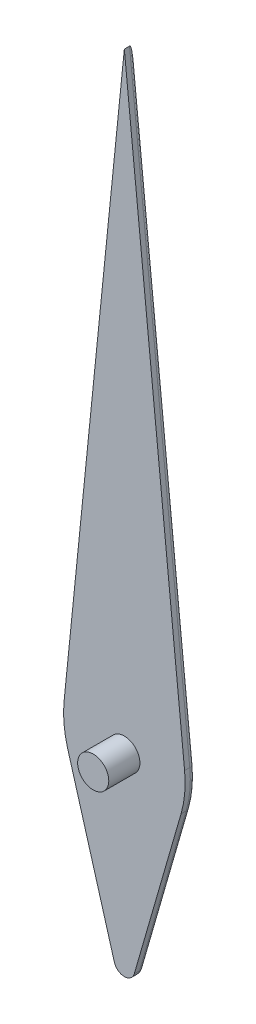
ISO-10303-21;
HEADER;
FILE_DESCRIPTION(('STEP AP214'),'2;1');
FILE_NAME('part.step','',(''),(''),'','','');
FILE_SCHEMA(('AUTOMOTIVE_DESIGN { 1 0 10303 214 1 1 1 1 }'));
ENDSEC;
DATA;
#1=APPLICATION_CONTEXT('core data for automotive mechanical design processes');
#2=APPLICATION_PROTOCOL_DEFINITION('international standard','automotive_design',2000,#1);
#3=PRODUCT_CONTEXT('',#1,'mechanical');
#4=PRODUCT('Part','Part','',(#3));
#5=PRODUCT_RELATED_PRODUCT_CATEGORY('part','',(#4));
#6=PRODUCT_DEFINITION_FORMATION('','',#4);
#7=PRODUCT_DEFINITION_CONTEXT('part definition',#1,'design');
#8=PRODUCT_DEFINITION('design','',#6,#7);
#9=PRODUCT_DEFINITION_SHAPE('','',#8);
#10=(LENGTH_UNIT() NAMED_UNIT(*) SI_UNIT(.MILLI.,.METRE.));
#11=(NAMED_UNIT(*) PLANE_ANGLE_UNIT() SI_UNIT($,.RADIAN.));
#12=(NAMED_UNIT(*) SI_UNIT($,.STERADIAN.) SOLID_ANGLE_UNIT());
#13=UNCERTAINTY_MEASURE_WITH_UNIT(LENGTH_MEASURE(1.E-05),#10,'distance_accuracy_value','');
#14=(GEOMETRIC_REPRESENTATION_CONTEXT(3) GLOBAL_UNCERTAINTY_ASSIGNED_CONTEXT((#13)) GLOBAL_UNIT_ASSIGNED_CONTEXT((#10,
#11,#12)) REPRESENTATION_CONTEXT('',''));
#15=CARTESIAN_POINT('',(0.,0.,0.));
#16=DIRECTION('',(0.,0.,1.));
#17=DIRECTION('',(1.,0.,0.));
#18=AXIS2_PLACEMENT_3D('',#15,#16,#17);
#19=CARTESIAN_POINT('',(0.414403604912211,2.16897108510449,0.1));
#20=DIRECTION('',(0.,0.,1.));
#21=DIRECTION('',(1.,0.,0.));
#22=AXIS2_PLACEMENT_3D('',#19,#20,#21);
#23=PLANE('',#22);
#24=DIRECTION('',(0.277491390365258,-0.960728124014883,0.));
#25=VECTOR('',#24,1.);
#26=CARTESIAN_POINT('',(-0.546324519102673,1.89147969473923,0.1));
#27=LINE('',#26,#25);
#28=CARTESIAN_POINT('',(-0.546324519102673,1.89147969473923,0.1));
#29=VERTEX_POINT('',#28);
#30=CARTESIAN_POINT('',(-0.0960728124014884,0.332622402107044,0.1));
#31=VERTEX_POINT('',#30);
#32=EDGE_CURVE('E211',#29,#31,#27,.T.);
#33=ORIENTED_EDGE('',*,*,#32,.T.);
#34=CARTESIAN_POINT('',(0.,0.360371541143569,0.1));
#35=DIRECTION('',(0.,0.,1.));
#36=DIRECTION('',(1.,0.,0.));
#37=AXIS2_PLACEMENT_3D('',#34,#35,#36);
#38=CIRCLE('',#37,0.1);
#39=CARTESIAN_POINT('',(0.0960728124014884,0.332622402107044,0.1));
#40=VERTEX_POINT('',#39);
#41=EDGE_CURVE('E121',#31,#40,#38,.T.);
#42=ORIENTED_EDGE('',*,*,#41,.T.);
#43=DIRECTION('',(0.277491390365258,0.960728124014883,0.));
#44=VECTOR('',#43,1.);
#45=CARTESIAN_POINT('',(0.546324519102673,1.89147969473923,0.1));
#46=LINE('',#45,#44);
#47=CARTESIAN_POINT('',(0.546324519102672,1.89147969473923,0.1));
#48=VERTEX_POINT('',#47);
#49=EDGE_CURVE('E114',#40,#48,#46,.T.);
#50=ORIENTED_EDGE('',*,*,#49,.T.);
#51=CARTESIAN_POINT('',(-0.414403604912211,2.16897108510449,0.1));
#52=DIRECTION('',(0.,0.,1.));
#53=DIRECTION('',(1.,0.,0.));
#54=AXIS2_PLACEMENT_3D('',#51,#52,#53);
#55=CIRCLE('',#54,1.);
#56=CARTESIAN_POINT('',(0.580504165533117,2.26976060989504,0.1));
#57=VERTEX_POINT('',#56);
#58=EDGE_CURVE('E118',#48,#57,#55,.T.);
#59=ORIENTED_EDGE('',*,*,#58,.T.);
#60=DIRECTION('',(-0.100789524790552,0.994907770445329,0.));
#61=VECTOR('',#60,1.);
#62=CARTESIAN_POINT('',(0.,8.,0.1));
#63=LINE('',#62,#61);
#64=CARTESIAN_POINT('',(0.,8.,0.1));
#65=VERTEX_POINT('',#64);
#66=EDGE_CURVE('E134',#57,#65,#63,.T.);
#67=ORIENTED_EDGE('',*,*,#66,.T.);
#68=DIRECTION('',(-0.100789524790552,-0.994907770445329,0.));
#69=VECTOR('',#68,1.);
#70=CARTESIAN_POINT('',(0.,8.,0.1));
#71=LINE('',#70,#69);
#72=CARTESIAN_POINT('',(-0.580504165533118,2.26976060989504,0.1));
#73=VERTEX_POINT('',#72);
#74=EDGE_CURVE('E207',#65,#73,#71,.T.);
#75=ORIENTED_EDGE('',*,*,#74,.T.);
#76=CARTESIAN_POINT('',(0.414403604912211,2.16897108510449,0.1));
#77=DIRECTION('',(0.,0.,1.));
#78=DIRECTION('',(1.,0.,0.));
#79=AXIS2_PLACEMENT_3D('',#76,#77,#78);
#80=CIRCLE('',#79,1.);
#81=EDGE_CURVE('E209',#73,#29,#80,.T.);
#82=ORIENTED_EDGE('',*,*,#81,.T.);
#83=EDGE_LOOP('',(#33,#42,#50,#59,#67,#75,#82));
#84=FACE_BOUND('',#83,.T.);
#85=CARTESIAN_POINT('',(0.,2.11792614708809,0.1));
#86=DIRECTION('',(0.,0.,1.));
#87=DIRECTION('',(1.,0.,0.));
#88=AXIS2_PLACEMENT_3D('',#85,#86,#87);
#89=CIRCLE('',#88,0.15);
#90=CARTESIAN_POINT('',(0.15,2.11792614708809,0.1));
#91=VERTEX_POINT('',#90);
#92=EDGE_CURVE('E194',#91,#91,#89,.T.);
#93=ORIENTED_EDGE('',*,*,#92,.F.);
#94=EDGE_LOOP('',(#93));
#95=FACE_BOUND('',#94,.T.);
#96=ADVANCED_FACE('F34',(#84,#95),#23,.T.);
#97=CARTESIAN_POINT('',(0.546324519102673,1.89147969473923,0.1));
#98=DIRECTION('',(-0.960728124014883,0.277491390365258,0.));
#99=DIRECTION('',(-0.277491390365258,-0.960728124014883,0.));
#100=AXIS2_PLACEMENT_3D('',#97,#98,#99);
#101=PLANE('',#100);
#102=DIRECTION('',(0.,0.,-1.));
#103=VECTOR('',#102,1.);
#104=CARTESIAN_POINT('',(0.0960728124014882,0.332622402107043,0.1));
#105=LINE('',#104,#103);
#106=CARTESIAN_POINT('',(0.0960728124014882,0.332622402107043,0.05));
#107=VERTEX_POINT('',#106);
#108=EDGE_CURVE('E139',#40,#107,#105,.T.);
#109=ORIENTED_EDGE('',*,*,#108,.T.);
#110=DIRECTION('',(0.277491390365258,0.960728124014883,0.));
#111=VECTOR('',#110,1.);
#112=CARTESIAN_POINT('',(0.546324519102673,1.89147969473923,0.05));
#113=LINE('',#112,#111);
#114=CARTESIAN_POINT('',(0.546324519102672,1.89147969473923,0.05));
#115=VERTEX_POINT('',#114);
#116=EDGE_CURVE('E138',#107,#115,#113,.T.);
#117=ORIENTED_EDGE('',*,*,#116,.T.);
#118=DIRECTION('',(0.,0.,-1.));
#119=VECTOR('',#118,1.);
#120=CARTESIAN_POINT('',(0.546324519102672,1.89147969473923,0.1));
#121=LINE('',#120,#119);
#122=EDGE_CURVE('E129',#48,#115,#121,.T.);
#123=ORIENTED_EDGE('',*,*,#122,.F.);
#124=ORIENTED_EDGE('',*,*,#49,.F.);
#125=EDGE_LOOP('',(#109,#117,#123,#124));
#126=FACE_BOUND('',#125,.T.);
#127=ADVANCED_FACE('F136',(#126),#101,.F.);
#128=CARTESIAN_POINT('',(-0.414403604912211,2.16897108510449,0.1));
#129=DIRECTION('',(0.,0.,-1.));
#130=DIRECTION('',(-1.,0.,0.));
#131=AXIS2_PLACEMENT_3D('',#128,#129,#130);
#132=CYLINDRICAL_SURFACE('',#131,1.);
#133=ORIENTED_EDGE('',*,*,#122,.T.);
#134=CARTESIAN_POINT('',(-0.414403604912211,2.16897108510449,0.05));
#135=DIRECTION('',(0.,0.,1.));
#136=DIRECTION('',(1.,0.,0.));
#137=AXIS2_PLACEMENT_3D('',#134,#135,#136);
#138=CIRCLE('',#137,1.);
#139=CARTESIAN_POINT('',(0.580504165533117,2.26976060989504,0.05));
#140=VERTEX_POINT('',#139);
#141=EDGE_CURVE('E171',#115,#140,#138,.T.);
#142=ORIENTED_EDGE('',*,*,#141,.T.);
#143=DIRECTION('',(0.,0.,-1.));
#144=VECTOR('',#143,1.);
#145=CARTESIAN_POINT('',(0.580504165533117,2.26976060989504,0.1));
#146=LINE('',#145,#144);
#147=EDGE_CURVE('E132',#57,#140,#146,.T.);
#148=ORIENTED_EDGE('',*,*,#147,.F.);
#149=ORIENTED_EDGE('',*,*,#58,.F.);
#150=EDGE_LOOP('',(#133,#142,#148,#149));
#151=FACE_BOUND('',#150,.T.);
#152=ADVANCED_FACE('F128',(#151),#132,.T.);
#153=CARTESIAN_POINT('',(0.,8.,0.1));
#154=DIRECTION('',(-0.994907770445329,-0.100789524790552,0.));
#155=DIRECTION('',(0.100789524790552,-0.994907770445329,0.));
#156=AXIS2_PLACEMENT_3D('',#153,#154,#155);
#157=PLANE('',#156);
#158=ORIENTED_EDGE('',*,*,#147,.T.);
#159=DIRECTION('',(-0.100789524790552,0.994907770445329,0.));
#160=VECTOR('',#159,1.);
#161=CARTESIAN_POINT('',(0.,8.,0.05));
#162=LINE('',#161,#160);
#163=CARTESIAN_POINT('',(0.,8.,0.05));
#164=VERTEX_POINT('',#163);
#165=EDGE_CURVE('E169',#140,#164,#162,.T.);
#166=ORIENTED_EDGE('',*,*,#165,.T.);
#167=DIRECTION('',(0.,0.,-1.));
#168=VECTOR('',#167,1.);
#169=CARTESIAN_POINT('',(0.,8.,0.1));
#170=LINE('',#169,#168);
#171=EDGE_CURVE('E143',#65,#164,#170,.T.);
#172=ORIENTED_EDGE('',*,*,#171,.F.);
#173=ORIENTED_EDGE('',*,*,#66,.F.);
#174=EDGE_LOOP('',(#158,#166,#172,#173));
#175=FACE_BOUND('',#174,.T.);
#176=ADVANCED_FACE('F260',(#175),#157,.F.);
#177=CARTESIAN_POINT('',(0.,8.,0.1));
#178=DIRECTION('',(0.994907770445329,-0.100789524790552,0.));
#179=DIRECTION('',(0.100789524790552,0.994907770445329,0.));
#180=AXIS2_PLACEMENT_3D('',#177,#178,#179);
#181=PLANE('',#180);
#182=ORIENTED_EDGE('',*,*,#171,.T.);
#183=DIRECTION('',(-0.100789524790552,-0.994907770445329,0.));
#184=VECTOR('',#183,1.);
#185=CARTESIAN_POINT('',(0.,8.,0.05));
#186=LINE('',#185,#184);
#187=CARTESIAN_POINT('',(-0.580504165533118,2.26976060989504,0.05));
#188=VERTEX_POINT('',#187);
#189=EDGE_CURVE('E149',#164,#188,#186,.T.);
#190=ORIENTED_EDGE('',*,*,#189,.T.);
#191=DIRECTION('',(0.,0.,-1.));
#192=VECTOR('',#191,1.);
#193=CARTESIAN_POINT('',(-0.580504165533118,2.26976060989504,0.1));
#194=LINE('',#193,#192);
#195=EDGE_CURVE('E215',#73,#188,#194,.T.);
#196=ORIENTED_EDGE('',*,*,#195,.F.);
#197=ORIENTED_EDGE('',*,*,#74,.F.);
#198=EDGE_LOOP('',(#182,#190,#196,#197));
#199=FACE_BOUND('',#198,.T.);
#200=ADVANCED_FACE('F222',(#199),#181,.F.);
#201=CARTESIAN_POINT('',(0.414403604912211,2.16897108510449,0.1));
#202=DIRECTION('',(0.,0.,-1.));
#203=DIRECTION('',(-1.,0.,0.));
#204=AXIS2_PLACEMENT_3D('',#201,#202,#203);
#205=CYLINDRICAL_SURFACE('',#204,1.);
#206=ORIENTED_EDGE('',*,*,#195,.T.);
#207=CARTESIAN_POINT('',(0.414403604912211,2.16897108510449,0.05));
#208=DIRECTION('',(0.,0.,1.));
#209=DIRECTION('',(1.,0.,0.));
#210=AXIS2_PLACEMENT_3D('',#207,#208,#209);
#211=CIRCLE('',#210,1.);
#212=CARTESIAN_POINT('',(-0.546324519102673,1.89147969473923,0.05));
#213=VERTEX_POINT('',#212);
#214=EDGE_CURVE('E167',#188,#213,#211,.T.);
#215=ORIENTED_EDGE('',*,*,#214,.T.);
#216=DIRECTION('',(0.,0.,-1.));
#217=VECTOR('',#216,1.);
#218=CARTESIAN_POINT('',(-0.546324519102673,1.89147969473923,0.1));
#219=LINE('',#218,#217);
#220=EDGE_CURVE('E213',#29,#213,#219,.T.);
#221=ORIENTED_EDGE('',*,*,#220,.F.);
#222=ORIENTED_EDGE('',*,*,#81,.F.);
#223=EDGE_LOOP('',(#206,#215,#221,#222));
#224=FACE_BOUND('',#223,.T.);
#225=ADVANCED_FACE('F241',(#224),#205,.T.);
#226=CARTESIAN_POINT('',(-0.546324519102673,1.89147969473923,0.1));
#227=DIRECTION('',(0.960728124014883,0.277491390365258,0.));
#228=DIRECTION('',(-0.277491390365258,0.960728124014883,0.));
#229=AXIS2_PLACEMENT_3D('',#226,#227,#228);
#230=PLANE('',#229);
#231=ORIENTED_EDGE('',*,*,#220,.T.);
#232=DIRECTION('',(0.277491390365258,-0.960728124014883,0.));
#233=VECTOR('',#232,1.);
#234=CARTESIAN_POINT('',(-0.546324519102673,1.89147969473923,0.05));
#235=LINE('',#234,#233);
#236=CARTESIAN_POINT('',(-0.0960728124014881,0.332622402107043,0.05));
#237=VERTEX_POINT('',#236);
#238=EDGE_CURVE('E42',#213,#237,#235,.T.);
#239=ORIENTED_EDGE('',*,*,#238,.T.);
#240=DIRECTION('',(0.,0.,-1.));
#241=VECTOR('',#240,1.);
#242=CARTESIAN_POINT('',(-0.0960728124014881,0.332622402107043,0.1));
#243=LINE('',#242,#241);
#244=EDGE_CURVE('E141',#237,#31,#243,.F.);
#245=ORIENTED_EDGE('',*,*,#244,.T.);
#246=ORIENTED_EDGE('',*,*,#32,.F.);
#247=EDGE_LOOP('',(#231,#239,#245,#246));
#248=FACE_BOUND('',#247,.T.);
#249=ADVANCED_FACE('F244',(#248),#230,.F.);
#250=CARTESIAN_POINT('',(0.414403604912211,2.16897108510449,0.));
#251=DIRECTION('',(0.,0.,1.));
#252=DIRECTION('',(1.,0.,0.));
#253=AXIS2_PLACEMENT_3D('',#250,#251,#252);
#254=PLANE('',#253);
#255=CARTESIAN_POINT('',(0.,2.11792614708809,0.));
#256=DIRECTION('',(0.,0.,1.));
#257=DIRECTION('',(1.,0.,0.));
#258=AXIS2_PLACEMENT_3D('',#255,#256,#257);
#259=CIRCLE('',#258,0.2);
#260=CARTESIAN_POINT('',(0.2,2.11792614708809,0.));
#261=VERTEX_POINT('',#260);
#262=EDGE_CURVE('E11',#261,#261,#259,.T.);
#263=ORIENTED_EDGE('',*,*,#262,.T.);
#264=EDGE_LOOP('',(#263));
#265=FACE_BOUND('',#264,.T.);
#266=CARTESIAN_POINT('',(0.414403604912211,2.16897108510449,0.));
#267=DIRECTION('',(0.,0.,1.));
#268=DIRECTION('',(1.,0.,0.));
#269=AXIS2_PLACEMENT_3D('',#266,#267,#268);
#270=CIRCLE('',#269,0.95);
#271=CARTESIAN_POINT('',(-0.498288112901929,1.90535426425749,0.));
#272=VERTEX_POINT('',#271);
#273=CARTESIAN_POINT('',(-0.530758777010852,2.26472113365551,0.));
#274=VERTEX_POINT('',#273);
#275=EDGE_CURVE('E162',#272,#274,#270,.F.);
#276=ORIENTED_EDGE('',*,*,#275,.T.);
#277=DIRECTION('',(-0.100789524790552,-0.994907770445329,0.));
#278=VECTOR('',#277,1.);
#279=CARTESIAN_POINT('',(-0.530758777010851,2.26472113365551,0.));
#280=LINE('',#279,#278);
#281=CARTESIAN_POINT('',(0.,7.50391670063031,0.));
#282=VERTEX_POINT('',#281);
#283=EDGE_CURVE('E164',#274,#282,#280,.F.);
#284=ORIENTED_EDGE('',*,*,#283,.T.);
#285=DIRECTION('',(-0.100789524790552,0.994907770445329,0.));
#286=VECTOR('',#285,1.);
#287=CARTESIAN_POINT('',(0.539178238513317,2.18161142866211,0.));
#288=LINE('',#287,#286);
#289=CARTESIAN_POINT('',(0.530758777010852,2.26472113365551,0.));
#290=VERTEX_POINT('',#289);
#291=EDGE_CURVE('E160',#282,#290,#288,.F.);
#292=ORIENTED_EDGE('',*,*,#291,.T.);
#293=CARTESIAN_POINT('',(-0.414403604912211,2.16897108510449,0.));
#294=DIRECTION('',(0.,0.,1.));
#295=DIRECTION('',(1.,0.,0.));
#296=AXIS2_PLACEMENT_3D('',#293,#294,#295);
#297=CIRCLE('',#296,0.95);
#298=CARTESIAN_POINT('',(0.498288112901929,1.90535426425749,0.));
#299=VERTEX_POINT('',#298);
#300=EDGE_CURVE('E158',#290,#299,#297,.F.);
#301=ORIENTED_EDGE('',*,*,#300,.T.);
#302=DIRECTION('',(0.277491390365258,0.960728124014883,0.));
#303=VECTOR('',#302,1.);
#304=CARTESIAN_POINT('',(0.562107487836228,2.12630911361598,0.));
#305=LINE('',#304,#303);
#306=CARTESIAN_POINT('',(0.0480364062007441,0.346496971625306,0.));
#307=VERTEX_POINT('',#306);
#308=EDGE_CURVE('E156',#299,#307,#305,.F.);
#309=ORIENTED_EDGE('',*,*,#308,.T.);
#310=CARTESIAN_POINT('',(0.,0.360371541143569,0.));
#311=DIRECTION('',(0.,0.,1.));
#312=DIRECTION('',(1.,0.,0.));
#313=AXIS2_PLACEMENT_3D('',#310,#311,#312);
#314=CIRCLE('',#313,0.05);
#315=CARTESIAN_POINT('',(-0.048036406200744,0.346496971625306,0.));
#316=VERTEX_POINT('',#315);
#317=EDGE_CURVE('E154',#307,#316,#314,.F.);
#318=ORIENTED_EDGE('',*,*,#317,.T.);
#319=DIRECTION('',(0.277491390365258,-0.960728124014883,0.));
#320=VECTOR('',#319,1.);
#321=CARTESIAN_POINT('',(-0.498288112901929,1.90535426425749,0.));
#322=LINE('',#321,#320);
#323=EDGE_CURVE('E152',#316,#272,#322,.F.);
#324=ORIENTED_EDGE('',*,*,#323,.T.);
#325=EDGE_LOOP('',(#276,#284,#292,#301,#309,#318,#324));
#326=FACE_BOUND('',#325,.T.);
#327=ADVANCED_FACE('F251',(#265,#326),#254,.F.);
#328=CARTESIAN_POINT('',(0.,2.11792614708809,0.4));
#329=DIRECTION('',(0.,0.,-1.));
#330=DIRECTION('',(-1.,0.,0.));
#331=AXIS2_PLACEMENT_3D('',#328,#329,#330);
#332=CYLINDRICAL_SURFACE('',#331,0.15);
#333=CARTESIAN_POINT('',(0.,2.11792614708809,0.4));
#334=DIRECTION('',(0.,0.,1.));
#335=DIRECTION('',(1.,0.,0.));
#336=AXIS2_PLACEMENT_3D('',#333,#334,#335);
#337=CIRCLE('',#336,0.15);
#338=CARTESIAN_POINT('',(0.15,2.11792614708809,0.4));
#339=VERTEX_POINT('',#338);
#340=EDGE_CURVE('E124',#339,#339,#337,.T.);
#341=ORIENTED_EDGE('',*,*,#340,.F.);
#342=EDGE_LOOP('',(#341));
#343=FACE_BOUND('',#342,.T.);
#344=ORIENTED_EDGE('',*,*,#92,.T.);
#345=EDGE_LOOP('',(#344));
#346=FACE_BOUND('',#345,.T.);
#347=ADVANCED_FACE('F269',(#343,#346),#332,.T.);
#348=CARTESIAN_POINT('',(0.,2.11792614708809,0.4));
#349=DIRECTION('',(0.,0.,1.));
#350=DIRECTION('',(1.,0.,0.));
#351=AXIS2_PLACEMENT_3D('',#348,#349,#350);
#352=PLANE('',#351);
#353=ORIENTED_EDGE('',*,*,#340,.T.);
#354=EDGE_LOOP('',(#353));
#355=FACE_BOUND('',#354,.T.);
#356=ADVANCED_FACE('F263',(#355),#352,.T.);
#357=CARTESIAN_POINT('',(0.,0.360371541143569,0.1));
#358=DIRECTION('',(0.,0.,-1.));
#359=DIRECTION('',(-1.,0.,0.));
#360=AXIS2_PLACEMENT_3D('',#357,#358,#359);
#361=CYLINDRICAL_SURFACE('',#360,0.1);
#362=ORIENTED_EDGE('',*,*,#244,.F.);
#363=CARTESIAN_POINT('',(0.,0.360371541143569,0.05));
#364=DIRECTION('',(0.,0.,1.));
#365=DIRECTION('',(1.,0.,0.));
#366=AXIS2_PLACEMENT_3D('',#363,#364,#365);
#367=CIRCLE('',#366,0.1);
#368=EDGE_CURVE('E55',#237,#107,#367,.T.);
#369=ORIENTED_EDGE('',*,*,#368,.T.);
#370=ORIENTED_EDGE('',*,*,#108,.F.);
#371=ORIENTED_EDGE('',*,*,#41,.F.);
#372=EDGE_LOOP('',(#362,#369,#370,#371));
#373=FACE_BOUND('',#372,.T.);
#374=ADVANCED_FACE('F261',(#373),#361,.T.);
#375=CARTESIAN_POINT('',(0.498288112901929,1.90535426425749,0.05));
#376=DIRECTION('',(0.277491390365258,0.960728124014883,0.));
#377=DIRECTION('',(-0.960728124014883,0.277491390365258,0.));
#378=AXIS2_PLACEMENT_3D('',#375,#376,#377);
#379=CYLINDRICAL_SURFACE('',#378,0.05);
#380=CARTESIAN_POINT('',(0.498288112901929,1.90535426425749,0.05));
#381=DIRECTION('',(0.277491390365258,0.960728124014883,0.));
#382=DIRECTION('',(-0.960728124014883,0.277491390365259,0.));
#383=AXIS2_PLACEMENT_3D('',#380,#381,#382);
#384=CIRCLE('',#383,0.05);
#385=EDGE_CURVE('E190',#115,#299,#384,.T.);
#386=ORIENTED_EDGE('',*,*,#385,.F.);
#387=ORIENTED_EDGE('',*,*,#116,.F.);
#388=CARTESIAN_POINT('',(0.048036406200744,0.346496971625306,0.05));
#389=DIRECTION('',(-0.277491390365258,-0.960728124014883,0.));
#390=DIRECTION('',(0.960728124014883,-0.277491390365259,0.));
#391=AXIS2_PLACEMENT_3D('',#388,#389,#390);
#392=CIRCLE('',#391,0.05);
#393=EDGE_CURVE('E192',#307,#107,#392,.T.);
#394=ORIENTED_EDGE('',*,*,#393,.F.);
#395=ORIENTED_EDGE('',*,*,#308,.F.);
#396=EDGE_LOOP('',(#386,#387,#394,#395));
#397=FACE_BOUND('',#396,.T.);
#398=ADVANCED_FACE('F255',(#397),#379,.T.);
#399=CARTESIAN_POINT('',(0.,0.360371541143569,0.05));
#400=DIRECTION('',(0.,0.,1.));
#401=DIRECTION('',(1.,0.,0.));
#402=AXIS2_PLACEMENT_3D('',#399,#400,#401);
#403=DEGENERATE_TOROIDAL_SURFACE('',#402,0.05,0.05,.T.);
#404=ORIENTED_EDGE('',*,*,#393,.T.);
#405=ORIENTED_EDGE('',*,*,#368,.F.);
#406=CARTESIAN_POINT('',(-0.0480364062007441,0.346496971625306,0.05));
#407=DIRECTION('',(-0.277491390365261,0.960728124014882,0.));
#408=DIRECTION('',(-0.960728124014882,-0.277491390365261,0.));
#409=AXIS2_PLACEMENT_3D('',#406,#407,#408);
#410=CIRCLE('',#409,0.05);
#411=EDGE_CURVE('E187',#316,#237,#410,.T.);
#412=ORIENTED_EDGE('',*,*,#411,.F.);
#413=ORIENTED_EDGE('',*,*,#317,.F.);
#414=EDGE_LOOP('',(#404,#405,#412,#413));
#415=FACE_BOUND('',#414,.T.);
#416=ADVANCED_FACE('F249',(#415),#403,.T.);
#417=CARTESIAN_POINT('',(-0.414403604912211,2.16897108510449,0.05));
#418=DIRECTION('',(0.,0.,1.));
#419=DIRECTION('',(1.,0.,0.));
#420=AXIS2_PLACEMENT_3D('',#417,#418,#419);
#421=TOROIDAL_SURFACE('',#420,0.95,0.05);
#422=ORIENTED_EDGE('',*,*,#385,.T.);
#423=ORIENTED_EDGE('',*,*,#300,.F.);
#424=CARTESIAN_POINT('',(0.530758777010852,2.26472113365551,0.05));
#425=DIRECTION('',(-0.10078952479055,0.994907770445329,0.));
#426=DIRECTION('',(-0.994907770445329,-0.10078952479055,0.));
#427=AXIS2_PLACEMENT_3D('',#424,#425,#426);
#428=CIRCLE('',#427,0.05);
#429=EDGE_CURVE('E184',#140,#290,#428,.T.);
#430=ORIENTED_EDGE('',*,*,#429,.F.);
#431=ORIENTED_EDGE('',*,*,#141,.F.);
#432=EDGE_LOOP('',(#422,#423,#430,#431));
#433=FACE_BOUND('',#432,.T.);
#434=ADVANCED_FACE('F259',(#433),#421,.T.);
#435=CARTESIAN_POINT('',(-0.498288112901929,1.90535426425749,0.05));
#436=DIRECTION('',(0.277491390365258,-0.960728124014883,0.));
#437=DIRECTION('',(0.960728124014883,0.277491390365258,0.));
#438=AXIS2_PLACEMENT_3D('',#435,#436,#437);
#439=CYLINDRICAL_SURFACE('',#438,0.05);
#440=ORIENTED_EDGE('',*,*,#411,.T.);
#441=ORIENTED_EDGE('',*,*,#238,.F.);
#442=CARTESIAN_POINT('',(-0.498288112901929,1.90535426425749,0.05));
#443=DIRECTION('',(-0.277491390365258,0.960728124014883,0.));
#444=DIRECTION('',(-0.960728124014883,-0.277491390365259,0.));
#445=AXIS2_PLACEMENT_3D('',#442,#443,#444);
#446=CIRCLE('',#445,0.05);
#447=EDGE_CURVE('E181',#272,#213,#446,.T.);
#448=ORIENTED_EDGE('',*,*,#447,.F.);
#449=ORIENTED_EDGE('',*,*,#323,.F.);
#450=EDGE_LOOP('',(#440,#441,#448,#449));
#451=FACE_BOUND('',#450,.T.);
#452=ADVANCED_FACE('F246',(#451),#439,.T.);
#453=CARTESIAN_POINT('',(-0.0497453885222664,7.99496052376047,0.05));
#454=DIRECTION('',(-0.100789524790552,0.994907770445329,0.));
#455=DIRECTION('',(-0.994907770445329,-0.100789524790552,0.));
#456=AXIS2_PLACEMENT_3D('',#453,#454,#455);
#457=CYLINDRICAL_SURFACE('',#456,0.05);
#458=ORIENTED_EDGE('',*,*,#429,.T.);
#459=ORIENTED_EDGE('',*,*,#291,.F.);
#460=CARTESIAN_POINT('',(0.,7.50391670063031,0.05));
#461=DIRECTION('',(-1.,0.,0.));
#462=DIRECTION('',(0.,1.,0.));
#463=AXIS2_PLACEMENT_3D('',#460,#461,#462);
#464=ELLIPSE('',#463,0.496083299369693,0.05);
#465=EDGE_CURVE('E178',#164,#282,#464,.T.);
#466=ORIENTED_EDGE('',*,*,#465,.F.);
#467=ORIENTED_EDGE('',*,*,#165,.F.);
#468=EDGE_LOOP('',(#458,#459,#466,#467));
#469=FACE_BOUND('',#468,.T.);
#470=ADVANCED_FACE('F229',(#469),#457,.T.);
#471=CARTESIAN_POINT('',(0.414403604912211,2.16897108510449,0.05));
#472=DIRECTION('',(0.,0.,1.));
#473=DIRECTION('',(1.,0.,0.));
#474=AXIS2_PLACEMENT_3D('',#471,#472,#473);
#475=TOROIDAL_SURFACE('',#474,0.95,0.05);
#476=ORIENTED_EDGE('',*,*,#447,.T.);
#477=ORIENTED_EDGE('',*,*,#214,.F.);
#478=CARTESIAN_POINT('',(-0.530758777010852,2.26472113365551,0.05));
#479=DIRECTION('',(0.10078952479055,0.994907770445329,0.));
#480=DIRECTION('',(-0.994907770445329,0.10078952479055,0.));
#481=AXIS2_PLACEMENT_3D('',#478,#479,#480);
#482=CIRCLE('',#481,0.05);
#483=EDGE_CURVE('E176',#274,#188,#482,.T.);
#484=ORIENTED_EDGE('',*,*,#483,.F.);
#485=ORIENTED_EDGE('',*,*,#275,.F.);
#486=EDGE_LOOP('',(#476,#477,#484,#485));
#487=FACE_BOUND('',#486,.T.);
#488=ADVANCED_FACE('F237',(#487),#475,.T.);
#489=CARTESIAN_POINT('',(0.0497453885222664,7.99496052376047,0.05));
#490=DIRECTION('',(-0.100789524790552,-0.994907770445329,0.));
#491=DIRECTION('',(0.994907770445329,-0.100789524790552,0.));
#492=AXIS2_PLACEMENT_3D('',#489,#490,#491);
#493=CYLINDRICAL_SURFACE('',#492,0.05);
#494=ORIENTED_EDGE('',*,*,#465,.T.);
#495=ORIENTED_EDGE('',*,*,#283,.F.);
#496=ORIENTED_EDGE('',*,*,#483,.T.);
#497=ORIENTED_EDGE('',*,*,#189,.F.);
#498=EDGE_LOOP('',(#494,#495,#496,#497));
#499=FACE_BOUND('',#498,.T.);
#500=ADVANCED_FACE('F232',(#499),#493,.T.);
#501=CARTESIAN_POINT('',(0.,2.11792614708809,0.05));
#502=DIRECTION('',(0.,0.,-1.));
#503=DIRECTION('',(-1.,0.,0.));
#504=AXIS2_PLACEMENT_3D('',#501,#502,#503);
#505=PLANE('',#504);
#506=CARTESIAN_POINT('',(0.,2.11792614708809,0.05));
#507=DIRECTION('',(0.,0.,-1.));
#508=DIRECTION('',(-1.,0.,0.));
#509=AXIS2_PLACEMENT_3D('',#506,#507,#508);
#510=CIRCLE('',#509,0.15);
#511=CARTESIAN_POINT('',(-0.15,2.11792614708809,0.05));
#512=VERTEX_POINT('',#511);
#513=EDGE_CURVE('E179',#512,#512,#510,.T.);
#514=ORIENTED_EDGE('',*,*,#513,.T.);
#515=EDGE_LOOP('',(#514));
#516=FACE_BOUND('',#515,.T.);
#517=ADVANCED_FACE('F407',(#516),#505,.T.);
#518=CARTESIAN_POINT('',(0.,2.11792614708809,0.05));
#519=DIRECTION('',(0.,0.,1.));
#520=DIRECTION('',(1.,0.,0.));
#521=AXIS2_PLACEMENT_3D('',#518,#519,#520);
#522=TOROIDAL_SURFACE('',#521,0.2,0.05);
#523=ORIENTED_EDGE('',*,*,#262,.F.);
#524=EDGE_LOOP('',(#523));
#525=FACE_BOUND('',#524,.T.);
#526=ORIENTED_EDGE('',*,*,#513,.F.);
#527=EDGE_LOOP('',(#526));
#528=FACE_BOUND('',#527,.T.);
#529=ADVANCED_FACE('F36',(#525,#528),#522,.T.);
#530=CLOSED_SHELL('',(#96,#127,#152,#176,#200,#225,#249,#327,#347,#356,#374,#398,#416,#434,#452,
#470,#488,#500,#517,#529));
#531=MANIFOLD_SOLID_BREP('B2',#530);
#532=ADVANCED_BREP_SHAPE_REPRESENTATION('',(#18,#531),#14);
#533=SHAPE_DEFINITION_REPRESENTATION(#9,#532);
ENDSEC;
END-ISO-10303-21;
